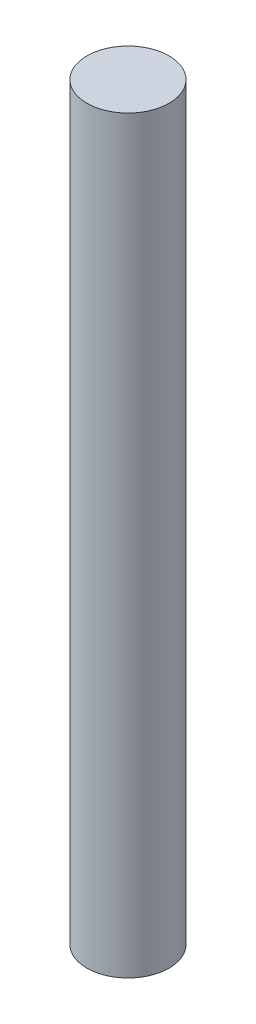
ISO-10303-21;
HEADER;
FILE_DESCRIPTION(('STEP AP214'),'2;1');
FILE_NAME('part.step','',(''),(''),'','','');
FILE_SCHEMA(('AUTOMOTIVE_DESIGN { 1 0 10303 214 1 1 1 1 }'));
ENDSEC;
DATA;
#1=APPLICATION_CONTEXT('core data for automotive mechanical design processes');
#2=APPLICATION_PROTOCOL_DEFINITION('international standard','automotive_design',2000,#1);
#3=PRODUCT_CONTEXT('',#1,'mechanical');
#4=PRODUCT('Part','Part','',(#3));
#5=PRODUCT_RELATED_PRODUCT_CATEGORY('part','',(#4));
#6=PRODUCT_DEFINITION_FORMATION('','',#4);
#7=PRODUCT_DEFINITION_CONTEXT('part definition',#1,'design');
#8=PRODUCT_DEFINITION('design','',#6,#7);
#9=PRODUCT_DEFINITION_SHAPE('','',#8);
#10=(LENGTH_UNIT() NAMED_UNIT(*) SI_UNIT(.MILLI.,.METRE.));
#11=(NAMED_UNIT(*) PLANE_ANGLE_UNIT() SI_UNIT($,.RADIAN.));
#12=(NAMED_UNIT(*) SI_UNIT($,.STERADIAN.) SOLID_ANGLE_UNIT());
#13=UNCERTAINTY_MEASURE_WITH_UNIT(LENGTH_MEASURE(1.E-05),#10,'distance_accuracy_value','');
#14=(GEOMETRIC_REPRESENTATION_CONTEXT(3) GLOBAL_UNCERTAINTY_ASSIGNED_CONTEXT((#13)) GLOBAL_UNIT_ASSIGNED_CONTEXT((#10,
#11,#12)) REPRESENTATION_CONTEXT('',''));
#15=CARTESIAN_POINT('',(0.,0.,0.));
#16=DIRECTION('',(0.,0.,1.));
#17=DIRECTION('',(1.,0.,0.));
#18=AXIS2_PLACEMENT_3D('',#15,#16,#17);
#19=CARTESIAN_POINT('',(0.,86.825,0.));
#20=DIRECTION('',(0.,-1.,0.));
#21=DIRECTION('',(0.,0.,-1.));
#22=AXIS2_PLACEMENT_3D('',#19,#20,#21);
#23=CYLINDRICAL_SURFACE('',#22,4.7625);
#24=CARTESIAN_POINT('',(0.,86.825,0.));
#25=DIRECTION('',(0.,1.,0.));
#26=DIRECTION('',(0.,0.,1.));
#27=AXIS2_PLACEMENT_3D('',#24,#25,#26);
#28=CIRCLE('',#27,4.7625);
#29=CARTESIAN_POINT('',(0.,86.825,4.7625));
#30=VERTEX_POINT('',#29);
#31=EDGE_CURVE('E10',#30,#30,#28,.T.);
#32=ORIENTED_EDGE('',*,*,#31,.F.);
#33=EDGE_LOOP('',(#32));
#34=FACE_BOUND('',#33,.T.);
#35=CARTESIAN_POINT('',(0.,0.,0.));
#36=DIRECTION('',(0.,1.,0.));
#37=DIRECTION('',(0.,0.,1.));
#38=AXIS2_PLACEMENT_3D('',#35,#36,#37);
#39=CIRCLE('',#38,4.7625);
#40=CARTESIAN_POINT('',(0.,0.,4.7625));
#41=VERTEX_POINT('',#40);
#42=EDGE_CURVE('E44',#41,#41,#39,.T.);
#43=ORIENTED_EDGE('',*,*,#42,.T.);
#44=EDGE_LOOP('',(#43));
#45=FACE_BOUND('',#44,.T.);
#46=ADVANCED_FACE('F41',(#34,#45),#23,.T.);
#47=CARTESIAN_POINT('',(0.,86.825,0.));
#48=DIRECTION('',(0.,1.,0.));
#49=DIRECTION('',(0.,0.,1.));
#50=AXIS2_PLACEMENT_3D('',#47,#48,#49);
#51=PLANE('',#50);
#52=ORIENTED_EDGE('',*,*,#31,.T.);
#53=EDGE_LOOP('',(#52));
#54=FACE_BOUND('',#53,.T.);
#55=ADVANCED_FACE('F58',(#54),#51,.T.);
#56=CARTESIAN_POINT('',(0.,0.,0.));
#57=DIRECTION('',(0.,1.,0.));
#58=DIRECTION('',(0.,0.,1.));
#59=AXIS2_PLACEMENT_3D('',#56,#57,#58);
#60=PLANE('',#59);
#61=ORIENTED_EDGE('',*,*,#42,.F.);
#62=EDGE_LOOP('',(#61));
#63=FACE_BOUND('',#62,.T.);
#64=ADVANCED_FACE('F56',(#63),#60,.F.);
#65=CLOSED_SHELL('',(#46,#55,#64));
#66=MANIFOLD_SOLID_BREP('B2',#65);
#67=ADVANCED_BREP_SHAPE_REPRESENTATION('',(#18,#66),#14);
#68=SHAPE_DEFINITION_REPRESENTATION(#9,#67);
ENDSEC;
END-ISO-10303-21;
